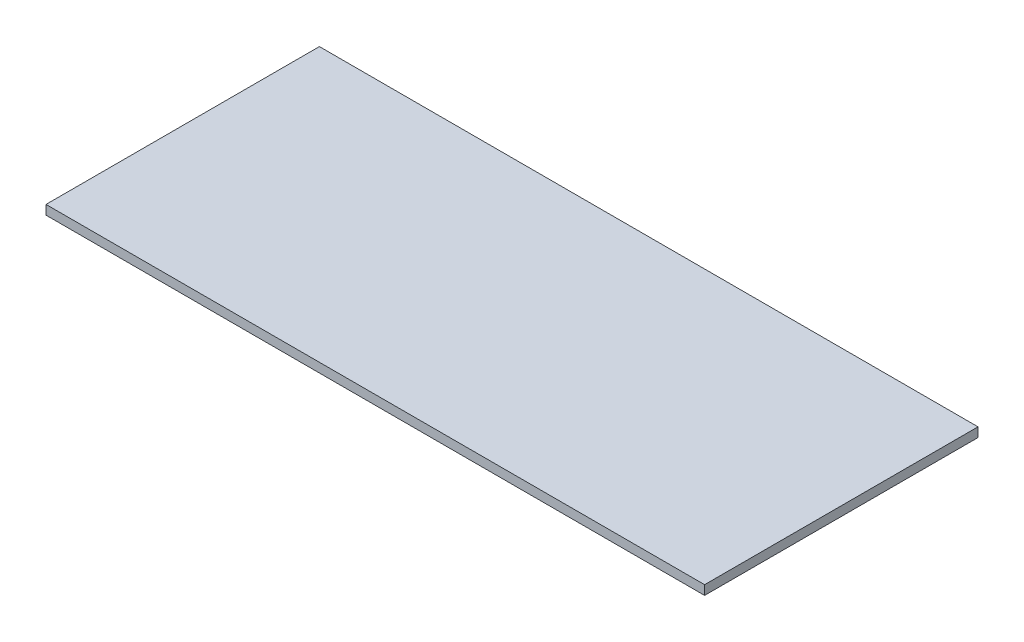
ISO-10303-21;
HEADER;
FILE_DESCRIPTION(('STEP AP214'),'2;1');
FILE_NAME('part.step','',(''),(''),'','','');
FILE_SCHEMA(('AUTOMOTIVE_DESIGN { 1 0 10303 214 1 1 1 1 }'));
ENDSEC;
DATA;
#1=APPLICATION_CONTEXT('core data for automotive mechanical design processes');
#2=APPLICATION_PROTOCOL_DEFINITION('international standard','automotive_design',2000,#1);
#3=PRODUCT_CONTEXT('',#1,'mechanical');
#4=PRODUCT('Part','Part','',(#3));
#5=PRODUCT_RELATED_PRODUCT_CATEGORY('part','',(#4));
#6=PRODUCT_DEFINITION_FORMATION('','',#4);
#7=PRODUCT_DEFINITION_CONTEXT('part definition',#1,'design');
#8=PRODUCT_DEFINITION('design','',#6,#7);
#9=PRODUCT_DEFINITION_SHAPE('','',#8);
#10=(LENGTH_UNIT() NAMED_UNIT(*) SI_UNIT(.MILLI.,.METRE.));
#11=(NAMED_UNIT(*) PLANE_ANGLE_UNIT() SI_UNIT($,.RADIAN.));
#12=(NAMED_UNIT(*) SI_UNIT($,.STERADIAN.) SOLID_ANGLE_UNIT());
#13=UNCERTAINTY_MEASURE_WITH_UNIT(LENGTH_MEASURE(1.E-05),#10,'distance_accuracy_value','');
#14=(GEOMETRIC_REPRESENTATION_CONTEXT(3) GLOBAL_UNCERTAINTY_ASSIGNED_CONTEXT((#13)) GLOBAL_UNIT_ASSIGNED_CONTEXT((#10,
#11,#12)) REPRESENTATION_CONTEXT('',''));
#15=CARTESIAN_POINT('',(0.,0.,0.));
#16=DIRECTION('',(0.,0.,1.));
#17=DIRECTION('',(1.,0.,0.));
#18=AXIS2_PLACEMENT_3D('',#15,#16,#17);
#19=CARTESIAN_POINT('',(673.1,19.05,279.4));
#20=DIRECTION('',(-1.,0.,0.));
#21=DIRECTION('',(0.,0.,1.));
#22=AXIS2_PLACEMENT_3D('',#19,#20,#21);
#23=PLANE('',#22);
#24=DIRECTION('',(0.,0.,-1.));
#25=VECTOR('',#24,1.);
#26=CARTESIAN_POINT('',(673.1,0.,279.4));
#27=LINE('',#26,#25);
#28=CARTESIAN_POINT('',(673.1,0.,279.4));
#29=VERTEX_POINT('',#28);
#30=CARTESIAN_POINT('',(673.1,0.,-279.4));
#31=VERTEX_POINT('',#30);
#32=EDGE_CURVE('E95',#29,#31,#27,.T.);
#33=ORIENTED_EDGE('',*,*,#32,.T.);
#34=DIRECTION('',(0.,-1.,0.));
#35=VECTOR('',#34,1.);
#36=CARTESIAN_POINT('',(673.1,19.05,-279.4));
#37=LINE('',#36,#35);
#38=CARTESIAN_POINT('',(673.1,19.05,-279.4));
#39=VERTEX_POINT('',#38);
#40=EDGE_CURVE('E11',#39,#31,#37,.T.);
#41=ORIENTED_EDGE('',*,*,#40,.F.);
#42=DIRECTION('',(0.,0.,-1.));
#43=VECTOR('',#42,1.);
#44=CARTESIAN_POINT('',(673.1,19.05,279.4));
#45=LINE('',#44,#43);
#46=CARTESIAN_POINT('',(673.1,19.05,279.4));
#47=VERTEX_POINT('',#46);
#48=EDGE_CURVE('E83',#47,#39,#45,.T.);
#49=ORIENTED_EDGE('',*,*,#48,.F.);
#50=DIRECTION('',(0.,-1.,0.));
#51=VECTOR('',#50,1.);
#52=CARTESIAN_POINT('',(673.1,19.05,279.4));
#53=LINE('',#52,#51);
#54=EDGE_CURVE('E91',#47,#29,#53,.T.);
#55=ORIENTED_EDGE('',*,*,#54,.T.);
#56=EDGE_LOOP('',(#33,#41,#49,#55));
#57=FACE_BOUND('',#56,.T.);
#58=ADVANCED_FACE('F32',(#57),#23,.F.);
#59=CARTESIAN_POINT('',(-673.1,19.05,-279.4));
#60=DIRECTION('',(0.,0.,1.));
#61=DIRECTION('',(1.,0.,0.));
#62=AXIS2_PLACEMENT_3D('',#59,#60,#61);
#63=PLANE('',#62);
#64=DIRECTION('',(-1.,0.,0.));
#65=VECTOR('',#64,1.);
#66=CARTESIAN_POINT('',(-673.1,0.,-279.4));
#67=LINE('',#66,#65);
#68=CARTESIAN_POINT('',(-673.1,0.,-279.4));
#69=VERTEX_POINT('',#68);
#70=EDGE_CURVE('E87',#31,#69,#67,.T.);
#71=ORIENTED_EDGE('',*,*,#70,.T.);
#72=DIRECTION('',(0.,-1.,0.));
#73=VECTOR('',#72,1.);
#74=CARTESIAN_POINT('',(-673.1,19.05,-279.4));
#75=LINE('',#74,#73);
#76=CARTESIAN_POINT('',(-673.1,19.05,-279.4));
#77=VERTEX_POINT('',#76);
#78=EDGE_CURVE('E40',#77,#69,#75,.T.);
#79=ORIENTED_EDGE('',*,*,#78,.F.);
#80=DIRECTION('',(-1.,0.,0.));
#81=VECTOR('',#80,1.);
#82=CARTESIAN_POINT('',(-673.1,19.05,-279.4));
#83=LINE('',#82,#81);
#84=EDGE_CURVE('E78',#39,#77,#83,.T.);
#85=ORIENTED_EDGE('',*,*,#84,.F.);
#86=ORIENTED_EDGE('',*,*,#40,.T.);
#87=EDGE_LOOP('',(#71,#79,#85,#86));
#88=FACE_BOUND('',#87,.T.);
#89=ADVANCED_FACE('F86',(#88),#63,.F.);
#90=CARTESIAN_POINT('',(-673.1,19.05,279.4));
#91=DIRECTION('',(1.,0.,0.));
#92=DIRECTION('',(0.,0.,-1.));
#93=AXIS2_PLACEMENT_3D('',#90,#91,#92);
#94=PLANE('',#93);
#95=DIRECTION('',(0.,0.,1.));
#96=VECTOR('',#95,1.);
#97=CARTESIAN_POINT('',(-673.1,0.,279.4));
#98=LINE('',#97,#96);
#99=CARTESIAN_POINT('',(-673.1,0.,279.4));
#100=VERTEX_POINT('',#99);
#101=EDGE_CURVE('E65',#69,#100,#98,.T.);
#102=ORIENTED_EDGE('',*,*,#101,.T.);
#103=DIRECTION('',(0.,-1.,0.));
#104=VECTOR('',#103,1.);
#105=CARTESIAN_POINT('',(-673.1,19.05,279.4));
#106=LINE('',#105,#104);
#107=CARTESIAN_POINT('',(-673.1,19.05,279.4));
#108=VERTEX_POINT('',#107);
#109=EDGE_CURVE('E88',#108,#100,#106,.T.);
#110=ORIENTED_EDGE('',*,*,#109,.F.);
#111=DIRECTION('',(0.,0.,1.));
#112=VECTOR('',#111,1.);
#113=CARTESIAN_POINT('',(-673.1,19.05,279.4));
#114=LINE('',#113,#112);
#115=EDGE_CURVE('E81',#77,#108,#114,.T.);
#116=ORIENTED_EDGE('',*,*,#115,.F.);
#117=ORIENTED_EDGE('',*,*,#78,.T.);
#118=EDGE_LOOP('',(#102,#110,#116,#117));
#119=FACE_BOUND('',#118,.T.);
#120=ADVANCED_FACE('F89',(#119),#94,.F.);
#121=CARTESIAN_POINT('',(-673.1,19.05,279.4));
#122=DIRECTION('',(0.,0.,-1.));
#123=DIRECTION('',(-1.,0.,0.));
#124=AXIS2_PLACEMENT_3D('',#121,#122,#123);
#125=PLANE('',#124);
#126=DIRECTION('',(1.,0.,0.));
#127=VECTOR('',#126,1.);
#128=CARTESIAN_POINT('',(-673.1,0.,279.4));
#129=LINE('',#128,#127);
#130=EDGE_CURVE('E71',#100,#29,#129,.T.);
#131=ORIENTED_EDGE('',*,*,#130,.T.);
#132=ORIENTED_EDGE('',*,*,#54,.F.);
#133=DIRECTION('',(1.,0.,0.));
#134=VECTOR('',#133,1.);
#135=CARTESIAN_POINT('',(-673.1,19.05,279.4));
#136=LINE('',#135,#134);
#137=EDGE_CURVE('E48',#108,#47,#136,.T.);
#138=ORIENTED_EDGE('',*,*,#137,.F.);
#139=ORIENTED_EDGE('',*,*,#109,.T.);
#140=EDGE_LOOP('',(#131,#132,#138,#139));
#141=FACE_BOUND('',#140,.T.);
#142=ADVANCED_FACE('F102',(#141),#125,.F.);
#143=CARTESIAN_POINT('',(0.,19.05,0.));
#144=DIRECTION('',(0.,-1.,0.));
#145=DIRECTION('',(0.,0.,-1.));
#146=AXIS2_PLACEMENT_3D('',#143,#144,#145);
#147=PLANE('',#146);
#148=ORIENTED_EDGE('',*,*,#48,.T.);
#149=ORIENTED_EDGE('',*,*,#84,.T.);
#150=ORIENTED_EDGE('',*,*,#115,.T.);
#151=ORIENTED_EDGE('',*,*,#137,.T.);
#152=EDGE_LOOP('',(#148,#149,#150,#151));
#153=FACE_BOUND('',#152,.T.);
#154=ADVANCED_FACE('F79',(#153),#147,.F.);
#155=CARTESIAN_POINT('',(0.,0.,0.));
#156=DIRECTION('',(0.,-1.,0.));
#157=DIRECTION('',(0.,0.,-1.));
#158=AXIS2_PLACEMENT_3D('',#155,#156,#157);
#159=PLANE('',#158);
#160=ORIENTED_EDGE('',*,*,#32,.F.);
#161=ORIENTED_EDGE('',*,*,#130,.F.);
#162=ORIENTED_EDGE('',*,*,#101,.F.);
#163=ORIENTED_EDGE('',*,*,#70,.F.);
#164=EDGE_LOOP('',(#160,#161,#162,#163));
#165=FACE_BOUND('',#164,.T.);
#166=ADVANCED_FACE('F105',(#165),#159,.T.);
#167=CLOSED_SHELL('',(#58,#89,#120,#142,#154,#166));
#168=MANIFOLD_SOLID_BREP('B2',#167);
#169=ADVANCED_BREP_SHAPE_REPRESENTATION('',(#18,#168),#14);
#170=SHAPE_DEFINITION_REPRESENTATION(#9,#169);
ENDSEC;
END-ISO-10303-21;
